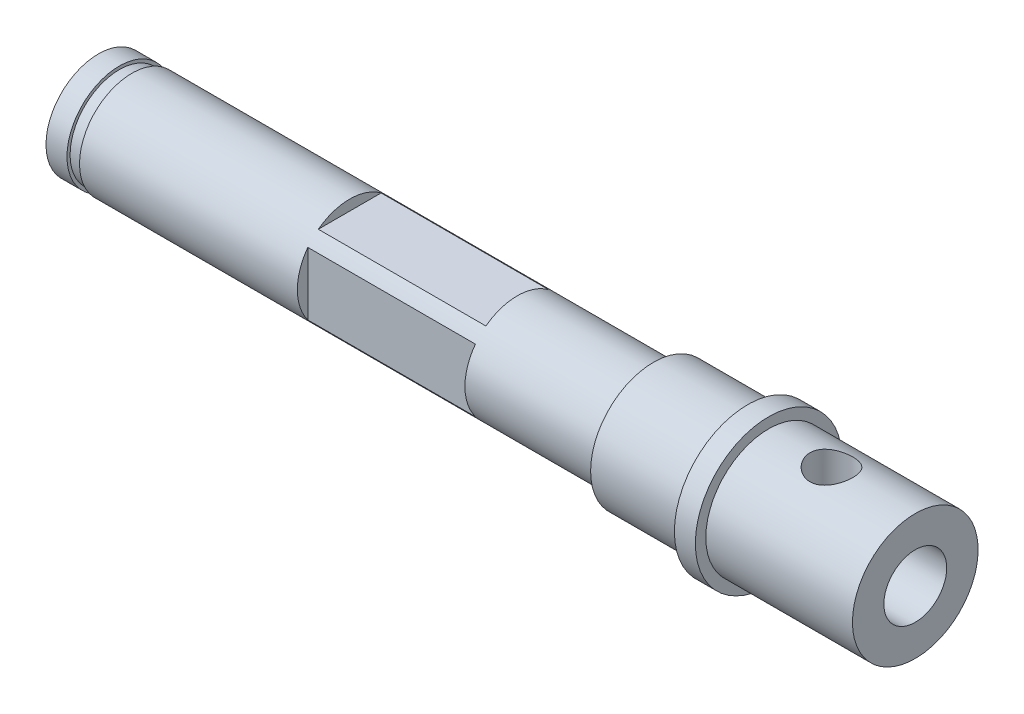
ISO-10303-21;
HEADER;
FILE_DESCRIPTION(('STEP AP214'),'2;1');
FILE_NAME('part.step','',(''),(''),'','','');
FILE_SCHEMA(('AUTOMOTIVE_DESIGN { 1 0 10303 214 1 1 1 1 }'));
ENDSEC;
DATA;
#1=APPLICATION_CONTEXT('core data for automotive mechanical design processes');
#2=APPLICATION_PROTOCOL_DEFINITION('international standard','automotive_design',2000,#1);
#3=PRODUCT_CONTEXT('',#1,'mechanical');
#4=PRODUCT('Part','Part','',(#3));
#5=PRODUCT_RELATED_PRODUCT_CATEGORY('part','',(#4));
#6=PRODUCT_DEFINITION_FORMATION('','',#4);
#7=PRODUCT_DEFINITION_CONTEXT('part definition',#1,'design');
#8=PRODUCT_DEFINITION('design','',#6,#7);
#9=PRODUCT_DEFINITION_SHAPE('','',#8);
#10=(LENGTH_UNIT() NAMED_UNIT(*) SI_UNIT(.MILLI.,.METRE.));
#11=(NAMED_UNIT(*) PLANE_ANGLE_UNIT() SI_UNIT($,.RADIAN.));
#12=(NAMED_UNIT(*) SI_UNIT($,.STERADIAN.) SOLID_ANGLE_UNIT());
#13=UNCERTAINTY_MEASURE_WITH_UNIT(LENGTH_MEASURE(1.E-05),#10,'distance_accuracy_value','');
#14=(GEOMETRIC_REPRESENTATION_CONTEXT(3) GLOBAL_UNCERTAINTY_ASSIGNED_CONTEXT((#13)) GLOBAL_UNIT_ASSIGNED_CONTEXT((#10,
#11,#12)) REPRESENTATION_CONTEXT('',''));
#15=CARTESIAN_POINT('',(0.,0.,0.));
#16=DIRECTION('',(0.,0.,1.));
#17=DIRECTION('',(1.,0.,0.));
#18=AXIS2_PLACEMENT_3D('',#15,#16,#17);
#19=CARTESIAN_POINT('',(0.,0.,0.));
#20=DIRECTION('',(1.,0.,0.));
#21=DIRECTION('',(0.,0.,-1.));
#22=AXIS2_PLACEMENT_3D('',#19,#20,#21);
#23=PLANE('',#22);
#24=CARTESIAN_POINT('',(0.,0.,0.));
#25=DIRECTION('',(-1.,0.,0.));
#26=DIRECTION('',(0.,0.,1.));
#27=AXIS2_PLACEMENT_3D('',#24,#25,#26);
#28=CIRCLE('',#27,2.5);
#29=CARTESIAN_POINT('',(0.,0.,2.5));
#30=VERTEX_POINT('',#29);
#31=EDGE_CURVE('E145',#30,#30,#28,.T.);
#32=ORIENTED_EDGE('',*,*,#31,.T.);
#33=EDGE_LOOP('',(#32));
#34=FACE_BOUND('',#33,.T.);
#35=ADVANCED_FACE('F38',(#34),#23,.F.);
#36=CARTESIAN_POINT('',(0.,0.,0.));
#37=DIRECTION('',(-1.,0.,0.));
#38=DIRECTION('',(0.,0.,1.));
#39=AXIS2_PLACEMENT_3D('',#36,#37,#38);
#40=CYLINDRICAL_SURFACE('',#39,2.5);
#41=ORIENTED_EDGE('',*,*,#31,.F.);
#42=EDGE_LOOP('',(#41));
#43=FACE_BOUND('',#42,.T.);
#44=CARTESIAN_POINT('',(1.,0.,0.));
#45=DIRECTION('',(-1.,0.,0.));
#46=DIRECTION('',(0.,0.,1.));
#47=AXIS2_PLACEMENT_3D('',#44,#45,#46);
#48=CIRCLE('',#47,2.5);
#49=CARTESIAN_POINT('',(1.,0.,2.5));
#50=VERTEX_POINT('',#49);
#51=EDGE_CURVE('E142',#50,#50,#48,.T.);
#52=ORIENTED_EDGE('',*,*,#51,.T.);
#53=EDGE_LOOP('',(#52));
#54=FACE_BOUND('',#53,.T.);
#55=ADVANCED_FACE('F182',(#43,#54),#40,.T.);
#56=CARTESIAN_POINT('',(1.,2.5,0.));
#57=DIRECTION('',(-1.,0.,0.));
#58=DIRECTION('',(0.,0.,1.));
#59=AXIS2_PLACEMENT_3D('',#56,#57,#58);
#60=PLANE('',#59);
#61=ORIENTED_EDGE('',*,*,#51,.F.);
#62=EDGE_LOOP('',(#61));
#63=FACE_BOUND('',#62,.T.);
#64=CARTESIAN_POINT('',(1.,0.,0.));
#65=DIRECTION('',(-1.,0.,0.));
#66=DIRECTION('',(0.,0.,1.));
#67=AXIS2_PLACEMENT_3D('',#64,#65,#66);
#68=CIRCLE('',#67,2.35);
#69=CARTESIAN_POINT('',(1.,0.,2.35));
#70=VERTEX_POINT('',#69);
#71=EDGE_CURVE('E139',#70,#70,#68,.T.);
#72=ORIENTED_EDGE('',*,*,#71,.T.);
#73=EDGE_LOOP('',(#72));
#74=FACE_BOUND('',#73,.T.);
#75=ADVANCED_FACE('F187',(#63,#74),#60,.F.);
#76=CARTESIAN_POINT('',(0.,0.,0.));
#77=DIRECTION('',(-1.,0.,0.));
#78=DIRECTION('',(0.,0.,1.));
#79=AXIS2_PLACEMENT_3D('',#76,#77,#78);
#80=CYLINDRICAL_SURFACE('',#79,2.35);
#81=ORIENTED_EDGE('',*,*,#71,.F.);
#82=EDGE_LOOP('',(#81));
#83=FACE_BOUND('',#82,.T.);
#84=CARTESIAN_POINT('',(1.6,0.,0.));
#85=DIRECTION('',(-1.,0.,0.));
#86=DIRECTION('',(0.,0.,1.));
#87=AXIS2_PLACEMENT_3D('',#84,#85,#86);
#88=CIRCLE('',#87,2.35);
#89=CARTESIAN_POINT('',(1.6,0.,2.35));
#90=VERTEX_POINT('',#89);
#91=EDGE_CURVE('E136',#90,#90,#88,.T.);
#92=ORIENTED_EDGE('',*,*,#91,.T.);
#93=EDGE_LOOP('',(#92));
#94=FACE_BOUND('',#93,.T.);
#95=ADVANCED_FACE('F195',(#83,#94),#80,.T.);
#96=CARTESIAN_POINT('',(1.6,2.35,0.));
#97=DIRECTION('',(1.,0.,0.));
#98=DIRECTION('',(0.,0.,-1.));
#99=AXIS2_PLACEMENT_3D('',#96,#97,#98);
#100=PLANE('',#99);
#101=ORIENTED_EDGE('',*,*,#91,.F.);
#102=EDGE_LOOP('',(#101));
#103=FACE_BOUND('',#102,.T.);
#104=CARTESIAN_POINT('',(1.6,0.,0.));
#105=DIRECTION('',(-1.,0.,0.));
#106=DIRECTION('',(0.,0.,1.));
#107=AXIS2_PLACEMENT_3D('',#104,#105,#106);
#108=CIRCLE('',#107,2.5);
#109=CARTESIAN_POINT('',(1.6,0.,2.5));
#110=VERTEX_POINT('',#109);
#111=EDGE_CURVE('E133',#110,#110,#108,.T.);
#112=ORIENTED_EDGE('',*,*,#111,.T.);
#113=EDGE_LOOP('',(#112));
#114=FACE_BOUND('',#113,.T.);
#115=ADVANCED_FACE('F201',(#103,#114),#100,.F.);
#116=CARTESIAN_POINT('',(0.,0.,0.));
#117=DIRECTION('',(-1.,0.,0.));
#118=DIRECTION('',(0.,0.,1.));
#119=AXIS2_PLACEMENT_3D('',#116,#117,#118);
#120=CYLINDRICAL_SURFACE('',#119,2.5);
#121=DIRECTION('',(-1.,0.,0.));
#122=VECTOR('',#121,1.);
#123=CARTESIAN_POINT('',(0.,2.,1.5));
#124=LINE('',#123,#122);
#125=CARTESIAN_POINT('',(20.,2.,1.5));
#126=VERTEX_POINT('',#125);
#127=CARTESIAN_POINT('',(12.,2.,1.5));
#128=VERTEX_POINT('',#127);
#129=EDGE_CURVE('E49',#126,#128,#124,.T.);
#130=ORIENTED_EDGE('',*,*,#129,.T.);
#131=CARTESIAN_POINT('',(12.,0.,0.));
#132=DIRECTION('',(-1.,0.,0.));
#133=DIRECTION('',(0.,0.,1.));
#134=AXIS2_PLACEMENT_3D('',#131,#132,#133);
#135=CIRCLE('',#134,2.5);
#136=CARTESIAN_POINT('',(12.,2.,-1.5));
#137=VERTEX_POINT('',#136);
#138=EDGE_CURVE('E158',#128,#137,#135,.T.);
#139=ORIENTED_EDGE('',*,*,#138,.T.);
#140=DIRECTION('',(-1.,0.,0.));
#141=VECTOR('',#140,1.);
#142=CARTESIAN_POINT('',(0.,2.,-1.5));
#143=LINE('',#142,#141);
#144=CARTESIAN_POINT('',(20.,2.,-1.5));
#145=VERTEX_POINT('',#144);
#146=EDGE_CURVE('E161',#137,#145,#143,.F.);
#147=ORIENTED_EDGE('',*,*,#146,.T.);
#148=CARTESIAN_POINT('',(20.,0.,0.));
#149=DIRECTION('',(1.,0.,0.));
#150=DIRECTION('',(0.,0.,-1.));
#151=AXIS2_PLACEMENT_3D('',#148,#149,#150);
#152=CIRCLE('',#151,2.5);
#153=EDGE_CURVE('E55',#145,#126,#152,.T.);
#154=ORIENTED_EDGE('',*,*,#153,.T.);
#155=EDGE_LOOP('',(#130,#139,#147,#154));
#156=FACE_BOUND('',#155,.T.);
#157=CARTESIAN_POINT('',(12.,0.,0.));
#158=DIRECTION('',(-1.,0.,0.));
#159=DIRECTION('',(0.,0.,1.));
#160=AXIS2_PLACEMENT_3D('',#157,#158,#159);
#161=CIRCLE('',#160,2.5);
#162=CARTESIAN_POINT('',(12.,-1.5,2.));
#163=VERTEX_POINT('',#162);
#164=CARTESIAN_POINT('',(12.,1.5,2.));
#165=VERTEX_POINT('',#164);
#166=EDGE_CURVE('E149',#163,#165,#161,.T.);
#167=ORIENTED_EDGE('',*,*,#166,.T.);
#168=DIRECTION('',(-1.,0.,0.));
#169=VECTOR('',#168,1.);
#170=CARTESIAN_POINT('',(0.,1.5,2.));
#171=LINE('',#170,#169);
#172=CARTESIAN_POINT('',(20.,1.5,2.));
#173=VERTEX_POINT('',#172);
#174=EDGE_CURVE('E154',#165,#173,#171,.F.);
#175=ORIENTED_EDGE('',*,*,#174,.T.);
#176=CARTESIAN_POINT('',(20.,0.,0.));
#177=DIRECTION('',(1.,0.,0.));
#178=DIRECTION('',(0.,0.,-1.));
#179=AXIS2_PLACEMENT_3D('',#176,#177,#178);
#180=CIRCLE('',#179,2.5);
#181=CARTESIAN_POINT('',(20.,-1.5,2.));
#182=VERTEX_POINT('',#181);
#183=EDGE_CURVE('E62',#173,#182,#180,.T.);
#184=ORIENTED_EDGE('',*,*,#183,.T.);
#185=DIRECTION('',(-1.,0.,0.));
#186=VECTOR('',#185,1.);
#187=CARTESIAN_POINT('',(0.,-1.5,2.));
#188=LINE('',#187,#186);
#189=EDGE_CURVE('E151',#182,#163,#188,.T.);
#190=ORIENTED_EDGE('',*,*,#189,.T.);
#191=EDGE_LOOP('',(#167,#175,#184,#190));
#192=FACE_BOUND('',#191,.T.);
#193=ORIENTED_EDGE('',*,*,#111,.F.);
#194=EDGE_LOOP('',(#193));
#195=FACE_BOUND('',#194,.T.);
#196=CARTESIAN_POINT('',(26.5,0.,0.));
#197=DIRECTION('',(-1.,0.,0.));
#198=DIRECTION('',(0.,0.,1.));
#199=AXIS2_PLACEMENT_3D('',#196,#197,#198);
#200=CIRCLE('',#199,2.5);
#201=CARTESIAN_POINT('',(26.5,0.,2.5));
#202=VERTEX_POINT('',#201);
#203=EDGE_CURVE('E130',#202,#202,#200,.T.);
#204=ORIENTED_EDGE('',*,*,#203,.T.);
#205=EDGE_LOOP('',(#204));
#206=FACE_BOUND('',#205,.T.);
#207=ADVANCED_FACE('F165',(#156,#192,#195,#206),#120,.T.);
#208=CARTESIAN_POINT('',(26.5,2.5,0.));
#209=DIRECTION('',(1.,0.,0.));
#210=DIRECTION('',(0.,0.,-1.));
#211=AXIS2_PLACEMENT_3D('',#208,#209,#210);
#212=PLANE('',#211);
#213=ORIENTED_EDGE('',*,*,#203,.F.);
#214=EDGE_LOOP('',(#213));
#215=FACE_BOUND('',#214,.T.);
#216=CARTESIAN_POINT('',(26.5,0.,0.));
#217=DIRECTION('',(-1.,0.,0.));
#218=DIRECTION('',(0.,0.,1.));
#219=AXIS2_PLACEMENT_3D('',#216,#217,#218);
#220=CIRCLE('',#219,3.);
#221=CARTESIAN_POINT('',(26.5,0.,3.));
#222=VERTEX_POINT('',#221);
#223=EDGE_CURVE('E127',#222,#222,#220,.T.);
#224=ORIENTED_EDGE('',*,*,#223,.T.);
#225=EDGE_LOOP('',(#224));
#226=FACE_BOUND('',#225,.T.);
#227=ADVANCED_FACE('F212',(#215,#226),#212,.F.);
#228=CARTESIAN_POINT('',(0.,0.,0.));
#229=DIRECTION('',(-1.,0.,0.));
#230=DIRECTION('',(0.,0.,1.));
#231=AXIS2_PLACEMENT_3D('',#228,#229,#230);
#232=CYLINDRICAL_SURFACE('',#231,3.);
#233=ORIENTED_EDGE('',*,*,#223,.F.);
#234=EDGE_LOOP('',(#233));
#235=FACE_BOUND('',#234,.T.);
#236=CARTESIAN_POINT('',(31.,0.,0.));
#237=DIRECTION('',(-1.,0.,0.));
#238=DIRECTION('',(0.,0.,1.));
#239=AXIS2_PLACEMENT_3D('',#236,#237,#238);
#240=CIRCLE('',#239,3.);
#241=CARTESIAN_POINT('',(31.,0.,3.));
#242=VERTEX_POINT('',#241);
#243=EDGE_CURVE('E124',#242,#242,#240,.T.);
#244=ORIENTED_EDGE('',*,*,#243,.T.);
#245=EDGE_LOOP('',(#244));
#246=FACE_BOUND('',#245,.T.);
#247=ADVANCED_FACE('F218',(#235,#246),#232,.T.);
#248=CARTESIAN_POINT('',(31.,3.,0.));
#249=DIRECTION('',(1.,0.,0.));
#250=DIRECTION('',(0.,0.,-1.));
#251=AXIS2_PLACEMENT_3D('',#248,#249,#250);
#252=PLANE('',#251);
#253=ORIENTED_EDGE('',*,*,#243,.F.);
#254=EDGE_LOOP('',(#253));
#255=FACE_BOUND('',#254,.T.);
#256=CARTESIAN_POINT('',(31.,0.,0.));
#257=DIRECTION('',(-1.,0.,0.));
#258=DIRECTION('',(0.,0.,1.));
#259=AXIS2_PLACEMENT_3D('',#256,#257,#258);
#260=CIRCLE('',#259,3.5);
#261=CARTESIAN_POINT('',(31.,0.,3.5));
#262=VERTEX_POINT('',#261);
#263=EDGE_CURVE('E121',#262,#262,#260,.T.);
#264=ORIENTED_EDGE('',*,*,#263,.T.);
#265=EDGE_LOOP('',(#264));
#266=FACE_BOUND('',#265,.T.);
#267=ADVANCED_FACE('F224',(#255,#266),#252,.F.);
#268=CARTESIAN_POINT('',(0.,0.,0.));
#269=DIRECTION('',(-1.,0.,0.));
#270=DIRECTION('',(0.,0.,1.));
#271=AXIS2_PLACEMENT_3D('',#268,#269,#270);
#272=CYLINDRICAL_SURFACE('',#271,3.5);
#273=ORIENTED_EDGE('',*,*,#263,.F.);
#274=EDGE_LOOP('',(#273));
#275=FACE_BOUND('',#274,.T.);
#276=CARTESIAN_POINT('',(32.,0.,0.));
#277=DIRECTION('',(-1.,0.,0.));
#278=DIRECTION('',(0.,0.,1.));
#279=AXIS2_PLACEMENT_3D('',#276,#277,#278);
#280=CIRCLE('',#279,3.5);
#281=CARTESIAN_POINT('',(32.,0.,3.5));
#282=VERTEX_POINT('',#281);
#283=EDGE_CURVE('E118',#282,#282,#280,.T.);
#284=ORIENTED_EDGE('',*,*,#283,.T.);
#285=EDGE_LOOP('',(#284));
#286=FACE_BOUND('',#285,.T.);
#287=ADVANCED_FACE('F230',(#275,#286),#272,.T.);
#288=CARTESIAN_POINT('',(32.,3.5,0.));
#289=DIRECTION('',(-1.,0.,0.));
#290=DIRECTION('',(0.,0.,1.));
#291=AXIS2_PLACEMENT_3D('',#288,#289,#290);
#292=PLANE('',#291);
#293=ORIENTED_EDGE('',*,*,#283,.F.);
#294=EDGE_LOOP('',(#293));
#295=FACE_BOUND('',#294,.T.);
#296=CARTESIAN_POINT('',(32.,0.,0.));
#297=DIRECTION('',(-1.,0.,0.));
#298=DIRECTION('',(0.,0.,1.));
#299=AXIS2_PLACEMENT_3D('',#296,#297,#298);
#300=CIRCLE('',#299,3.);
#301=CARTESIAN_POINT('',(32.,0.,3.));
#302=VERTEX_POINT('',#301);
#303=EDGE_CURVE('E115',#302,#302,#300,.T.);
#304=ORIENTED_EDGE('',*,*,#303,.T.);
#305=EDGE_LOOP('',(#304));
#306=FACE_BOUND('',#305,.T.);
#307=ADVANCED_FACE('F236',(#295,#306),#292,.F.);
#308=CARTESIAN_POINT('',(0.,0.,0.));
#309=DIRECTION('',(-1.,0.,0.));
#310=DIRECTION('',(0.,0.,1.));
#311=AXIS2_PLACEMENT_3D('',#308,#309,#310);
#312=CYLINDRICAL_SURFACE('',#311,3.);
#313=CARTESIAN_POINT('',(35.,2.81946360146749,1.025));
#314=CARTESIAN_POINT('',(34.9442601907513,2.81946314948273,1.02500056561832));
#315=CARTESIAN_POINT('',(34.8885242604648,2.82113458607686,1.02043794577452));
#316=CARTESIAN_POINT('',(34.7787093194484,2.82760275151599,1.00237359015758));
#317=CARTESIAN_POINT('',(34.7246305141459,2.83239986621125,0.988870750753108));
#318=CARTESIAN_POINT('',(34.6197395960496,2.84451395747483,0.953460182449132));
#319=CARTESIAN_POINT('',(34.5689210619482,2.85182578830797,0.931569606589714));
#320=CARTESIAN_POINT('',(34.471660549868,2.86813781666419,0.88006400903572));
#321=CARTESIAN_POINT('',(34.4252196156284,2.8771384153135,0.850447151494693));
#322=CARTESIAN_POINT('',(34.3361224105041,2.89622895849098,0.783024796160044));
#323=CARTESIAN_POINT('',(34.2936723100914,2.90634703561055,0.744954746470409));
#324=CARTESIAN_POINT('',(34.2156175523596,2.92629530840756,0.662270639184249));
#325=CARTESIAN_POINT('',(34.1800140581532,2.93612545493085,0.617655471958037));
#326=CARTESIAN_POINT('',(34.1157168057825,2.95471764789522,0.521628993283309));
#327=CARTESIAN_POINT('',(34.0872406123982,2.96344277469904,0.470064223873335));
#328=CARTESIAN_POINT('',(34.0394489105811,2.97850910542737,0.362526827113969));
#329=CARTESIAN_POINT('',(34.0201307999406,2.98485098642888,0.306555457147818));
#330=CARTESIAN_POINT('',(33.9919073225698,2.99423692225673,0.193956490045069));
#331=CARTESIAN_POINT('',(33.9826484350343,2.99739264439316,0.137426988079115));
#332=CARTESIAN_POINT('',(33.9736805054846,3.00044791701952,0.0235345033114806));
#333=CARTESIAN_POINT('',(33.9739688801391,3.00034834833742,-0.033828249827142));
#334=CARTESIAN_POINT('',(33.9838665528827,2.99697904888511,-0.145250650634687));
#335=CARTESIAN_POINT('',(33.9930915277174,2.99384003376262,-0.199349045078395));
#336=CARTESIAN_POINT('',(34.0199629011885,2.98491006160941,-0.305177760578966));
#337=CARTESIAN_POINT('',(34.0376098774848,2.97911892267224,-0.356907918933193));
#338=CARTESIAN_POINT('',(34.0810396150971,2.96537261973141,-0.457352990468921));
#339=CARTESIAN_POINT('',(34.1069287804767,2.95738935262361,-0.506017892591438));
#340=CARTESIAN_POINT('',(34.1660191953147,2.94008542013755,-0.598423734106464));
#341=CARTESIAN_POINT('',(34.1992225485163,2.93076437024883,-0.642163251354142));
#342=CARTESIAN_POINT('',(34.2739196974757,2.91122089139187,-0.72575948799331));
#343=CARTESIAN_POINT('',(34.3157415484413,2.90097667928376,-0.765318416853988));
#344=CARTESIAN_POINT('',(34.4055085211955,2.88112513454282,-0.836960777222394));
#345=CARTESIAN_POINT('',(34.4534546866191,2.87151791088304,-0.869042931986796));
#346=CARTESIAN_POINT('',(34.5550964350979,2.85390525575956,-0.9252619147344));
#347=CARTESIAN_POINT('',(34.6088702332042,2.84592723630639,-0.949266583343236));
#348=CARTESIAN_POINT('',(34.7200387043462,2.83279297336624,-0.987776727747508));
#349=CARTESIAN_POINT('',(34.7774317547326,2.82763547522303,-1.00228642776795));
#350=CARTESIAN_POINT('',(34.891312801408,2.82101238315106,-1.02077499830013));
#351=CARTESIAN_POINT('',(34.9477160130556,2.81938427691891,-1.0252178683824));
#352=CARTESIAN_POINT('',(35.0604735857654,2.81954887295408,-1.02476577325974));
#353=CARTESIAN_POINT('',(35.1168279541723,2.82134091285065,-1.01987261613878));
#354=CARTESIAN_POINT('',(35.2257281459957,2.82798125851968,-1.00130511491289));
#355=CARTESIAN_POINT('',(35.2783378316966,2.83271490644205,-0.987959858037612));
#356=CARTESIAN_POINT('',(35.380558320581,2.84457706612572,-0.953265492357319));
#357=CARTESIAN_POINT('',(35.4301685734845,2.8517060157687,-0.931914920029217));
#358=CARTESIAN_POINT('',(35.5267926908899,2.86784573836058,-0.881018695978648));
#359=CARTESIAN_POINT('',(35.5736673534325,2.87691072664774,-0.851226441057629));
#360=CARTESIAN_POINT('',(35.6619193519572,2.89579873289588,-0.784568623904484));
#361=CARTESIAN_POINT('',(35.7032949824731,2.90562198453795,-0.747700875907287));
#362=CARTESIAN_POINT('',(35.7815551354586,2.9255250826349,-0.665709161218799));
#363=CARTESIAN_POINT('',(35.818103371148,2.93559249745695,-0.620260215439244));
#364=CARTESIAN_POINT('',(35.8830797517914,2.95435860744046,-0.523626134814988));
#365=CARTESIAN_POINT('',(35.9115081392593,2.96305734347651,-0.472441171350486));
#366=CARTESIAN_POINT('',(35.9591870700455,2.97807054353103,-0.36600953192689));
#367=CARTESIAN_POINT('',(35.9784934077423,2.98439945166683,-0.310789997904256));
#368=CARTESIAN_POINT('',(36.0074601674,2.9940210425188,-0.197627546721218));
#369=CARTESIAN_POINT('',(36.0171242680537,2.997314883133,-0.139685677023634));
#370=CARTESIAN_POINT('',(36.0261880932989,3.00040345328593,-0.0257917146771147));
#371=CARTESIAN_POINT('',(36.0260694926578,3.00036238660531,0.0301179943722288));
#372=CARTESIAN_POINT('',(36.0167692032013,2.99719461082008,0.141083824576459));
#373=CARTESIAN_POINT('',(36.0075883133603,2.99406817373634,0.196140020546467));
#374=CARTESIAN_POINT('',(35.9807480610855,2.98514426773312,0.302878353898031));
#375=CARTESIAN_POINT('',(35.9632389419703,2.97939420182934,0.354602520854905));
#376=CARTESIAN_POINT('',(35.9203801128342,2.96581569727817,0.454396401851573));
#377=CARTESIAN_POINT('',(35.8950289626398,2.95798687690907,0.502465442612926));
#378=CARTESIAN_POINT('',(35.8360965626936,2.94068200578517,0.595582219909352));
#379=CARTESIAN_POINT('',(35.8022386422632,2.93115457598385,0.640445169255911));
#380=CARTESIAN_POINT('',(35.7277175173533,2.91164148852872,0.724008622844155));
#381=CARTESIAN_POINT('',(35.6870520866497,2.90165568175219,0.762707103046254));
#382=CARTESIAN_POINT('',(35.5980443432291,2.88185276720999,0.834488102853542));
#383=CARTESIAN_POINT('',(35.5494525785763,2.87206006745076,0.867269064698303));
#384=CARTESIAN_POINT('',(35.4471423286563,2.85425649802235,0.924182467328673));
#385=CARTESIAN_POINT('',(35.3934248584125,2.84624527661615,0.948316615926583));
#386=CARTESIAN_POINT('',(35.2839086960821,2.83321579413605,0.98655343189096));
#387=CARTESIAN_POINT('',(35.2282123519879,2.82811903659588,1.00092138410056));
#388=CARTESIAN_POINT('',(35.115008814272,2.82124382696874,1.02014250236542));
#389=CARTESIAN_POINT('',(35.05750234306,2.81946406774433,1.02499941649641));
#390=CARTESIAN_POINT('',(35.,2.81946360146749,1.025));
#391=B_SPLINE_CURVE_WITH_KNOTS('',3,(#313,#314,#315,#316,#317,#318,#319,#320,#321,#322,#323,
#324,#325,#326,#327,#328,#329,#330,#331,#332,#333,#334,#335,#336,#337,#338,#339,#340,#341,#342,
#343,#344,#345,#346,#347,#348,#349,#350,#351,#352,#353,#354,#355,#356,#357,#358,#359,#360,#361,
#362,#363,#364,#365,#366,#367,#368,#369,#370,#371,#372,#373,#374,#375,#376,#377,#378,#379,#380,
#381,#382,#383,#384,#385,#386,#387,#388,#389,#390),.UNSPECIFIED.,.T.,.F.,(4,2,2,2,2,2,2,2,2,2,2,
2,2,2,2,2,2,2,2,2,2,2,2,2,2,2,2,2,2,2,2,2,2,2,2,2,2,2,4),(0.,0.167006258588187,
0.334033137219551,0.500720250968174,0.667447007474322,0.840401632296518,1.01338561302386,
1.1911387809488,1.36884141118731,1.54007383757718,1.71125993168144,1.87539660800794,
2.03954454398721,2.20590391528944,2.37231119832927,2.54692358144218,2.72156575977282,
2.89894025626482,3.07623578671342,3.24517709972497,3.41408569763538,3.57679115294987,
3.73952636841432,3.90761785317398,4.0757613486735,4.25247286989664,4.4291791127565,
4.60479008661499,4.78033403597045,4.94724007751804,5.11413140515271,5.27811999430656,
5.44213871753772,5.61240405086443,5.78272517432812,5.96015022556375,6.13754021464045,
6.30989526883686,6.48218238829312),.UNSPECIFIED.);
#392=CARTESIAN_POINT('',(35.,2.81946360146749,1.025));
#393=VERTEX_POINT('',#392);
#394=EDGE_CURVE('E11',#393,#393,#391,.T.);
#395=ORIENTED_EDGE('',*,*,#394,.T.);
#396=EDGE_LOOP('',(#395));
#397=FACE_BOUND('',#396,.T.);
#398=ORIENTED_EDGE('',*,*,#303,.F.);
#399=EDGE_LOOP('',(#398));
#400=FACE_BOUND('',#399,.T.);
#401=CARTESIAN_POINT('',(39.,0.,0.));
#402=DIRECTION('',(-1.,0.,0.));
#403=DIRECTION('',(0.,0.,1.));
#404=AXIS2_PLACEMENT_3D('',#401,#402,#403);
#405=CIRCLE('',#404,3.);
#406=CARTESIAN_POINT('',(39.,0.,3.));
#407=VERTEX_POINT('',#406);
#408=EDGE_CURVE('E112',#407,#407,#405,.T.);
#409=ORIENTED_EDGE('',*,*,#408,.T.);
#410=EDGE_LOOP('',(#409));
#411=FACE_BOUND('',#410,.T.);
#412=ADVANCED_FACE('F242',(#397,#400,#411),#312,.T.);
#413=CARTESIAN_POINT('',(39.,3.,0.));
#414=DIRECTION('',(-1.,0.,0.));
#415=DIRECTION('',(0.,0.,1.));
#416=AXIS2_PLACEMENT_3D('',#413,#414,#415);
#417=PLANE('',#416);
#418=CARTESIAN_POINT('',(39.,0.,0.));
#419=DIRECTION('',(1.,0.,0.));
#420=DIRECTION('',(0.,0.,-1.));
#421=AXIS2_PLACEMENT_3D('',#418,#419,#420);
#422=CIRCLE('',#421,1.5);
#423=CARTESIAN_POINT('',(39.,0.,-1.5));
#424=VERTEX_POINT('',#423);
#425=EDGE_CURVE('E96',#424,#424,#422,.T.);
#426=ORIENTED_EDGE('',*,*,#425,.F.);
#427=EDGE_LOOP('',(#426));
#428=FACE_BOUND('',#427,.T.);
#429=ORIENTED_EDGE('',*,*,#408,.F.);
#430=EDGE_LOOP('',(#429));
#431=FACE_BOUND('',#430,.T.);
#432=ADVANCED_FACE('F248',(#428,#431),#417,.F.);
#433=CARTESIAN_POINT('',(12.,-2.5,2.));
#434=DIRECTION('',(-1.,0.,0.));
#435=DIRECTION('',(0.,0.,1.));
#436=AXIS2_PLACEMENT_3D('',#433,#434,#435);
#437=PLANE('',#436);
#438=ORIENTED_EDGE('',*,*,#166,.F.);
#439=DIRECTION('',(0.,-1.,0.));
#440=VECTOR('',#439,1.);
#441=CARTESIAN_POINT('',(12.,-2.5,2.));
#442=LINE('',#441,#440);
#443=EDGE_CURVE('E107',#165,#163,#442,.T.);
#444=ORIENTED_EDGE('',*,*,#443,.F.);
#445=EDGE_LOOP('',(#438,#444));
#446=FACE_BOUND('',#445,.T.);
#447=ADVANCED_FACE('F253',(#446),#437,.F.);
#448=CARTESIAN_POINT('',(20.,-2.5,2.));
#449=DIRECTION('',(1.,0.,0.));
#450=DIRECTION('',(0.,0.,-1.));
#451=AXIS2_PLACEMENT_3D('',#448,#449,#450);
#452=PLANE('',#451);
#453=DIRECTION('',(0.,1.,0.));
#454=VECTOR('',#453,1.);
#455=CARTESIAN_POINT('',(20.,-2.5,2.));
#456=LINE('',#455,#454);
#457=EDGE_CURVE('E110',#182,#173,#456,.T.);
#458=ORIENTED_EDGE('',*,*,#457,.F.);
#459=ORIENTED_EDGE('',*,*,#183,.F.);
#460=EDGE_LOOP('',(#458,#459));
#461=FACE_BOUND('',#460,.T.);
#462=ADVANCED_FACE('F259',(#461),#452,.F.);
#463=CARTESIAN_POINT('',(0.,0.,2.));
#464=DIRECTION('',(0.,0.,-1.));
#465=DIRECTION('',(-1.,0.,0.));
#466=AXIS2_PLACEMENT_3D('',#463,#464,#465);
#467=PLANE('',#466);
#468=ORIENTED_EDGE('',*,*,#457,.T.);
#469=ORIENTED_EDGE('',*,*,#174,.F.);
#470=ORIENTED_EDGE('',*,*,#443,.T.);
#471=ORIENTED_EDGE('',*,*,#189,.F.);
#472=EDGE_LOOP('',(#468,#469,#470,#471));
#473=FACE_BOUND('',#472,.T.);
#474=ADVANCED_FACE('F178',(#473),#467,.F.);
#475=CARTESIAN_POINT('',(12.,2.,2.5));
#476=DIRECTION('',(-1.,0.,0.));
#477=DIRECTION('',(0.,0.,1.));
#478=AXIS2_PLACEMENT_3D('',#475,#476,#477);
#479=PLANE('',#478);
#480=DIRECTION('',(0.,0.,1.));
#481=VECTOR('',#480,1.);
#482=CARTESIAN_POINT('',(12.,2.,2.5));
#483=LINE('',#482,#481);
#484=EDGE_CURVE('E95',#137,#128,#483,.T.);
#485=ORIENTED_EDGE('',*,*,#484,.F.);
#486=ORIENTED_EDGE('',*,*,#138,.F.);
#487=EDGE_LOOP('',(#485,#486));
#488=FACE_BOUND('',#487,.T.);
#489=ADVANCED_FACE('F171',(#488),#479,.F.);
#490=CARTESIAN_POINT('',(20.,2.,2.5));
#491=DIRECTION('',(1.,0.,0.));
#492=DIRECTION('',(0.,0.,-1.));
#493=AXIS2_PLACEMENT_3D('',#490,#491,#492);
#494=PLANE('',#493);
#495=DIRECTION('',(0.,0.,-1.));
#496=VECTOR('',#495,1.);
#497=CARTESIAN_POINT('',(20.,2.,2.5));
#498=LINE('',#497,#496);
#499=EDGE_CURVE('E99',#126,#145,#498,.T.);
#500=ORIENTED_EDGE('',*,*,#499,.F.);
#501=ORIENTED_EDGE('',*,*,#153,.F.);
#502=EDGE_LOOP('',(#500,#501));
#503=FACE_BOUND('',#502,.T.);
#504=ADVANCED_FACE('F169',(#503),#494,.F.);
#505=CARTESIAN_POINT('',(0.,2.,0.));
#506=DIRECTION('',(0.,-1.,0.));
#507=DIRECTION('',(0.,0.,-1.));
#508=AXIS2_PLACEMENT_3D('',#505,#506,#507);
#509=PLANE('',#508);
#510=ORIENTED_EDGE('',*,*,#499,.T.);
#511=ORIENTED_EDGE('',*,*,#146,.F.);
#512=ORIENTED_EDGE('',*,*,#484,.T.);
#513=ORIENTED_EDGE('',*,*,#129,.F.);
#514=EDGE_LOOP('',(#510,#511,#512,#513));
#515=FACE_BOUND('',#514,.T.);
#516=ADVANCED_FACE('F89',(#515),#509,.F.);
#517=CARTESIAN_POINT('',(29.,0.,0.));
#518=DIRECTION('',(1.,0.,0.));
#519=DIRECTION('',(0.,0.,-1.));
#520=AXIS2_PLACEMENT_3D('',#517,#518,#519);
#521=CONICAL_SURFACE('',#520,1.5,1.02974425867665);
#522=CARTESIAN_POINT('',(28.0987090714587,0.,0.));
#523=VERTEX_POINT('',#522);
#524=VERTEX_LOOP('',#523);
#525=FACE_BOUND('',#524,.T.);
#526=CARTESIAN_POINT('',(29.,0.,0.));
#527=DIRECTION('',(1.,0.,0.));
#528=DIRECTION('',(0.,0.,-1.));
#529=AXIS2_PLACEMENT_3D('',#526,#527,#528);
#530=CIRCLE('',#529,1.5);
#531=CARTESIAN_POINT('',(29.,0.,-1.5));
#532=VERTEX_POINT('',#531);
#533=EDGE_CURVE('E93',#532,#532,#530,.T.);
#534=ORIENTED_EDGE('',*,*,#533,.T.);
#535=EDGE_LOOP('',(#534));
#536=FACE_BOUND('',#535,.T.);
#537=ADVANCED_FACE('F85',(#525,#536),#521,.F.);
#538=CARTESIAN_POINT('',(39.,0.,0.));
#539=DIRECTION('',(1.,0.,0.));
#540=DIRECTION('',(0.,0.,-1.));
#541=AXIS2_PLACEMENT_3D('',#538,#539,#540);
#542=CYLINDRICAL_SURFACE('',#541,1.5);
#543=CARTESIAN_POINT('',(35.,1.09515980569048,1.025));
#544=CARTESIAN_POINT('',(35.0496121891198,1.09516708243747,1.02499603119121));
#545=CARTESIAN_POINT('',(35.0992532420877,1.09859765249465,1.02136401668892));
#546=CARTESIAN_POINT('',(35.1967276970823,1.11162962693285,1.00715646317257));
#547=CARTESIAN_POINT('',(35.2445570083155,1.12124420620741,0.996566098508763));
#548=CARTESIAN_POINT('',(35.3366650281589,1.14488001682741,0.96931312459345));
#549=CARTESIAN_POINT('',(35.3809752749858,1.15885476562938,0.952714284104684));
#550=CARTESIAN_POINT('',(35.4660953473697,1.1895550449598,0.914093515701558));
#551=CARTESIAN_POINT('',(35.5069046855917,1.20628095751451,0.892070834421813));
#552=CARTESIAN_POINT('',(35.591244987663,1.24390249375493,0.839005470478371));
#553=CARTESIAN_POINT('',(35.6341130172411,1.26503063508055,0.807073897398659));
#554=CARTESIAN_POINT('',(35.71446896104,1.30716169183045,0.736890691319373));
#555=CARTESIAN_POINT('',(35.7519506506911,1.32816443591364,0.698631854436267));
#556=CARTESIAN_POINT('',(35.8262635879379,1.37150983306863,0.609729413921713));
#557=CARTESIAN_POINT('',(35.8620892560049,1.39355378371546,0.558085162543694));
#558=CARTESIAN_POINT('',(35.9242055896127,1.43281301335623,0.447723366857427));
#559=CARTESIAN_POINT('',(35.9505142497423,1.45003739099084,0.3890194539764));
#560=CARTESIAN_POINT('',(35.9865675033864,1.47396117331425,0.282167589205078));
#561=CARTESIAN_POINT('',(35.9988363333202,1.48223054640506,0.235216520673379));
#562=CARTESIAN_POINT('',(36.0166259898953,1.49427552252262,0.139498880735744));
#563=CARTESIAN_POINT('',(36.0221520473069,1.49805460887249,0.0907337469120707));
#564=CARTESIAN_POINT('',(36.0261496969147,1.50078517271219,-0.00730729248687039));
#565=CARTESIAN_POINT('',(36.0246089915447,1.49972823456989,-0.0565839394561122));
#566=CARTESIAN_POINT('',(36.0145378123121,1.49286590563032,-0.154082415532114));
#567=CARTESIAN_POINT('',(36.0060053063232,1.48705913432247,-0.202303933787847));
#568=CARTESIAN_POINT('',(35.9826455263612,1.47135802432634,-0.295459709333194));
#569=CARTESIAN_POINT('',(35.9679426456878,1.46154456030662,-0.34043938966009));
#570=CARTESIAN_POINT('',(35.9329013439021,1.43857748417419,-0.427214261517571));
#571=CARTESIAN_POINT('',(35.9125618471712,1.42542323458948,-0.469008843302579));
#572=CARTESIAN_POINT('',(35.8643286120403,1.39500854740397,-0.553335208019098));
#573=CARTESIAN_POINT('',(35.8358419197239,1.3774524457448,-0.59541943675679));
#574=CARTESIAN_POINT('',(35.7734510378358,1.34051072970635,-0.67449244424375));
#575=CARTESIAN_POINT('',(35.7395406706492,1.3211230395641,-0.71147532195909));
#576=CARTESIAN_POINT('',(35.6606363024738,1.27848581276836,-0.78588183496803));
#577=CARTESIAN_POINT('',(35.6147386525079,1.2551432396916,-0.822297555716188));
#578=CARTESIAN_POINT('',(35.5168090524991,1.21019653560004,-0.887117488766867));
#579=CARTESIAN_POINT('',(35.464780111756,1.18859156044304,-0.915525608249216));
#580=CARTESIAN_POINT('',(35.3680635386904,1.15469192704242,-0.957726315545392));
#581=CARTESIAN_POINT('',(35.3245446150025,1.14140352343956,-0.973386191021647));
#582=CARTESIAN_POINT('',(35.2347811221476,1.11920375062754,-0.998834573563727));
#583=CARTESIAN_POINT('',(35.1885417548221,1.11028431371217,-1.00863391011691));
#584=CARTESIAN_POINT('',(35.0939617401204,1.09817855653767,-1.02180738545957));
#585=CARTESIAN_POINT('',(35.0456064577882,1.09504212782714,-1.02512562448822));
#586=CARTESIAN_POINT('',(34.9489300606081,1.09528429750622,-1.02486709512359));
#587=CARTESIAN_POINT('',(34.9006089440068,1.09866253293997,-1.0212907108551));
#588=CARTESIAN_POINT('',(34.8113680929924,1.11050697872749,-1.00838242282217));
#589=CARTESIAN_POINT('',(34.770248338331,1.11832500656098,-0.999780323457648));
#590=CARTESIAN_POINT('',(34.6901229775314,1.1374895064367,-0.977920586068663));
#591=CARTESIAN_POINT('',(34.6511194121312,1.1488393157299,-0.964658543232751));
#592=CARTESIAN_POINT('',(34.5583893952483,1.17970241047783,-0.926894310715016));
#593=CARTESIAN_POINT('',(34.5060789802633,1.20057616240811,-0.900025076866191));
#594=CARTESIAN_POINT('',(34.4073396447603,1.24445125416153,-0.838319234719754));
#595=CARTESIAN_POINT('',(34.3609220282871,1.26745654095432,-0.803467662560236));
#596=CARTESIAN_POINT('',(34.2738498101965,1.31350214995639,-0.725797760926877));
#597=CARTESIAN_POINT('',(34.2332916554856,1.33653786192846,-0.682868199797949));
#598=CARTESIAN_POINT('',(34.1596905323579,1.38007882867982,-0.589921562712736));
#599=CARTESIAN_POINT('',(34.126635866769,1.40058799893099,-0.539915718311165));
#600=CARTESIAN_POINT('',(34.0742467029622,1.43389744270881,-0.44282868132594));
#601=CARTESIAN_POINT('',(34.0535269168478,1.44741780040343,-0.396744444928369));
#602=CARTESIAN_POINT('',(34.018905143255,1.47028988959007,-0.301096398893838));
#603=CARTESIAN_POINT('',(34.0049988193082,1.47964427219557,-0.251534825454344));
#604=CARTESIAN_POINT('',(33.984698272112,1.49337065850729,-0.149940281668681));
#605=CARTESIAN_POINT('',(33.9783418237129,1.49771760490058,-0.0978962278188001));
#606=CARTESIAN_POINT('',(33.9736868553002,1.5008964969628,0.00671799789573922));
#607=CARTESIAN_POINT('',(33.975386338438,1.4997298093134,0.0592880361594189));
#608=CARTESIAN_POINT('',(33.9862384933221,1.49233853222369,0.15876060745718));
#609=CARTESIAN_POINT('',(33.9947526360853,1.48654735749063,0.205768084541143));
#610=CARTESIAN_POINT('',(34.0179859079878,1.4709360480884,0.297513055938424));
#611=CARTESIAN_POINT('',(34.0327063126425,1.46111508522547,0.342250081508229));
#612=CARTESIAN_POINT('',(34.068560963968,1.43762352634701,0.430614155333035));
#613=CARTESIAN_POINT('',(34.0899674710464,1.42379175690544,0.474086668272789));
#614=CARTESIAN_POINT('',(34.1381547229008,1.39348546774165,0.556907532347548));
#615=CARTESIAN_POINT('',(34.1649367405924,1.37701032225623,0.596254903286898));
#616=CARTESIAN_POINT('',(34.2278478002844,1.33972058208691,0.676307142184588));
#617=CARTESIAN_POINT('',(34.2647846971213,1.3186312668671,0.716249027258283));
#618=CARTESIAN_POINT('',(34.3444058924673,1.27594978135269,0.789788556482059));
#619=CARTESIAN_POINT('',(34.3871028849691,1.25435659010389,0.823371783104592));
#620=CARTESIAN_POINT('',(34.4839856729064,1.20976743379889,0.887802102628404));
#621=CARTESIAN_POINT('',(34.5389441212003,1.18698303454347,0.917648088859441));
#622=CARTESIAN_POINT('',(34.65501700967,1.14694033202441,0.967239607644066));
#623=CARTESIAN_POINT('',(34.7161045591006,1.12965916778574,0.987027134010748));
#624=CARTESIAN_POINT('',(34.8151771234834,1.1100899906067,1.00886646963228));
#625=CARTESIAN_POINT('',(34.8516624028536,1.10454997330847,1.01488884639825));
#626=CARTESIAN_POINT('',(34.925426713182,1.0970833437636,1.02295578450431));
#627=CARTESIAN_POINT('',(34.962705201215,1.0951543355667,1.02500298345886));
#628=CARTESIAN_POINT('',(35.,1.09515980569048,1.025));
#629=B_SPLINE_CURVE_WITH_KNOTS('',3,(#543,#544,#545,#546,#547,#548,#549,#550,#551,#552,#553,
#554,#555,#556,#557,#558,#559,#560,#561,#562,#563,#564,#565,#566,#567,#568,#569,#570,#571,#572,
#573,#574,#575,#576,#577,#578,#579,#580,#581,#582,#583,#584,#585,#586,#587,#588,#589,#590,#591,
#592,#593,#594,#595,#596,#597,#598,#599,#600,#601,#602,#603,#604,#605,#606,#607,#608,#609,#610,
#611,#612,#613,#614,#615,#616,#617,#618,#619,#620,#621,#622,#623,#624,#625,#626,#627,#628),
.UNSPECIFIED.,.T.,.F.,(4,2,2,2,2,2,2,2,2,2,2,2,2,2,2,2,2,2,2,2,2,2,2,2,2,2,2,2,2,2,2,2,2,2,2,2,
2,2,2,2,2,2,4),(0.,0.148660353531193,0.297638478448107,0.445079734075586,0.592541480688978,
0.764347698637892,0.936350889876644,1.13507427897233,1.33341993685771,1.48046447832038,
1.62739487590243,1.77458105837527,1.92181003483741,2.06620358225636,2.21062470285878,
2.37131861821876,2.53219688621906,2.72060994147006,2.90893090384165,3.05277036545767,
3.19634320318966,3.34114898837482,3.48594670613112,3.61363952381928,3.74145336929353,
3.92766922244027,4.11423705915026,4.30359187713406,4.49264945159239,4.64891740066703,
4.80508576246239,4.96203224495532,5.11893982667505,5.26265765045347,5.40640502562889,
5.5570037947997,5.70763826777844,5.88200760307296,6.05676768647562,6.25541030374013,
6.45321663767627,6.56504279382738,6.67679472557277),.UNSPECIFIED.);
#630=CARTESIAN_POINT('',(35.,1.09515980569048,1.025));
#631=VERTEX_POINT('',#630);
#632=EDGE_CURVE('E102',#631,#631,#629,.T.);
#633=ORIENTED_EDGE('',*,*,#632,.T.);
#634=EDGE_LOOP('',(#633));
#635=FACE_BOUND('',#634,.T.);
#636=ORIENTED_EDGE('',*,*,#533,.F.);
#637=EDGE_LOOP('',(#636));
#638=FACE_BOUND('',#637,.T.);
#639=ORIENTED_EDGE('',*,*,#425,.T.);
#640=EDGE_LOOP('',(#639));
#641=FACE_BOUND('',#640,.T.);
#642=ADVANCED_FACE('F88',(#635,#638,#641),#542,.F.);
#643=CARTESIAN_POINT('',(35.,3.,0.));
#644=DIRECTION('',(0.,1.,0.));
#645=DIRECTION('',(0.,0.,1.));
#646=AXIS2_PLACEMENT_3D('',#643,#644,#645);
#647=CYLINDRICAL_SURFACE('',#646,1.025);
#648=ORIENTED_EDGE('',*,*,#394,.F.);
#649=EDGE_LOOP('',(#648));
#650=FACE_BOUND('',#649,.T.);
#651=ORIENTED_EDGE('',*,*,#632,.F.);
#652=EDGE_LOOP('',(#651));
#653=FACE_BOUND('',#652,.T.);
#654=ADVANCED_FACE('F319',(#650,#653),#647,.F.);
#655=CLOSED_SHELL('',(#35,#55,#75,#95,#115,#207,#227,#247,#267,#287,#307,#412,#432,#447,#462,
#474,#489,#504,#516,#537,#642,#654));
#656=MANIFOLD_SOLID_BREP('B2',#655);
#657=ADVANCED_BREP_SHAPE_REPRESENTATION('',(#18,#656),#14);
#658=SHAPE_DEFINITION_REPRESENTATION(#9,#657);
ENDSEC;
END-ISO-10303-21;
